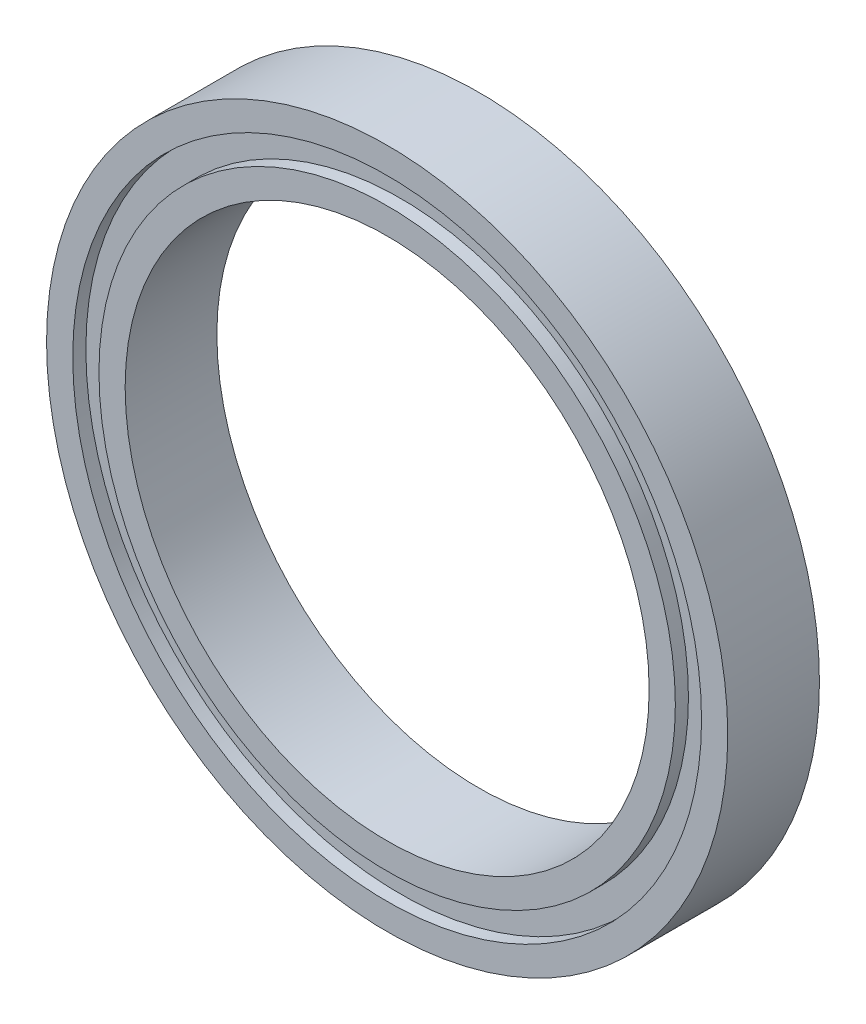
ISO-10303-21;
HEADER;
FILE_DESCRIPTION(('STEP AP214'),'2;1');
FILE_NAME('part.step','',(''),(''),'','','');
FILE_SCHEMA(('AUTOMOTIVE_DESIGN { 1 0 10303 214 1 1 1 1 }'));
ENDSEC;
DATA;
#1=APPLICATION_CONTEXT('core data for automotive mechanical design processes');
#2=APPLICATION_PROTOCOL_DEFINITION('international standard','automotive_design',2000,#1);
#3=PRODUCT_CONTEXT('',#1,'mechanical');
#4=PRODUCT('Part','Part','',(#3));
#5=PRODUCT_RELATED_PRODUCT_CATEGORY('part','',(#4));
#6=PRODUCT_DEFINITION_FORMATION('','',#4);
#7=PRODUCT_DEFINITION_CONTEXT('part definition',#1,'design');
#8=PRODUCT_DEFINITION('design','',#6,#7);
#9=PRODUCT_DEFINITION_SHAPE('','',#8);
#10=(LENGTH_UNIT() NAMED_UNIT(*) SI_UNIT(.MILLI.,.METRE.));
#11=(NAMED_UNIT(*) PLANE_ANGLE_UNIT() SI_UNIT($,.RADIAN.));
#12=(NAMED_UNIT(*) SI_UNIT($,.STERADIAN.) SOLID_ANGLE_UNIT());
#13=UNCERTAINTY_MEASURE_WITH_UNIT(LENGTH_MEASURE(1.E-05),#10,'distance_accuracy_value','');
#14=(GEOMETRIC_REPRESENTATION_CONTEXT(3) GLOBAL_UNCERTAINTY_ASSIGNED_CONTEXT((#13)) GLOBAL_UNIT_ASSIGNED_CONTEXT((#10,
#11,#12)) REPRESENTATION_CONTEXT('',''));
#15=CARTESIAN_POINT('',(0.,0.,0.));
#16=DIRECTION('',(0.,0.,1.));
#17=DIRECTION('',(1.,0.,0.));
#18=AXIS2_PLACEMENT_3D('',#15,#16,#17);
#19=CARTESIAN_POINT('',(0.,0.,-3.50000000000015));
#20=DIRECTION('',(0.,0.,1.));
#21=DIRECTION('',(0.999999999999999,0.,0.));
#22=AXIS2_PLACEMENT_3D('',#19,#20,#21);
#23=PLANE('',#22);
#24=CARTESIAN_POINT('',(0.,0.,-3.50000000000015));
#25=DIRECTION('',(0.,0.,1.));
#26=DIRECTION('',(0.999999999999999,0.,0.));
#27=AXIS2_PLACEMENT_3D('',#24,#25,#26);
#28=CIRCLE('',#27,26.);
#29=CARTESIAN_POINT('',(26.,-3.80834253022044E-13,-3.50000000000001));
#30=VERTEX_POINT('',#29);
#31=EDGE_CURVE('E45',#30,#30,#28,.T.);
#32=ORIENTED_EDGE('',*,*,#31,.F.);
#33=EDGE_LOOP('',(#32));
#34=FACE_BOUND('',#33,.T.);
#35=CARTESIAN_POINT('',(0.,0.,-3.50000000000015));
#36=DIRECTION('',(0.,0.,1.));
#37=DIRECTION('',(0.999999999999999,0.,0.));
#38=AXIS2_PLACEMENT_3D('',#35,#36,#37);
#39=CIRCLE('',#38,24.);
#40=CARTESIAN_POINT('',(24.,-3.56076279572903E-13,-3.50000000000002));
#41=VERTEX_POINT('',#40);
#42=EDGE_CURVE('E69',#41,#41,#39,.T.);
#43=ORIENTED_EDGE('',*,*,#42,.T.);
#44=EDGE_LOOP('',(#43));
#45=FACE_BOUND('',#44,.T.);
#46=ADVANCED_FACE('F34',(#34,#45),#23,.F.);
#47=CARTESIAN_POINT('',(0.,0.,3.49999999999989));
#48=DIRECTION('',(0.,0.,1.));
#49=DIRECTION('',(0.999999999999999,0.,0.));
#50=AXIS2_PLACEMENT_3D('',#47,#48,#49);
#51=PLANE('',#50);
#52=CARTESIAN_POINT('',(0.,0.,3.49999999999989));
#53=DIRECTION('',(0.,0.,1.));
#54=DIRECTION('',(0.999999999999999,0.,0.));
#55=AXIS2_PLACEMENT_3D('',#52,#53,#54);
#56=CIRCLE('',#55,20.);
#57=CARTESIAN_POINT('',(20.,-2.71865863155085E-13,3.5));
#58=VERTEX_POINT('',#57);
#59=EDGE_CURVE('E41',#58,#58,#56,.T.);
#60=ORIENTED_EDGE('',*,*,#59,.F.);
#61=EDGE_LOOP('',(#60));
#62=FACE_BOUND('',#61,.T.);
#63=CARTESIAN_POINT('',(0.,0.,3.49999999999989));
#64=DIRECTION('',(0.,0.,1.));
#65=DIRECTION('',(0.999999999999999,0.,0.));
#66=AXIS2_PLACEMENT_3D('',#63,#64,#65);
#67=CIRCLE('',#66,22.);
#68=CARTESIAN_POINT('',(22.,-2.96623836604226E-13,3.50000000000001));
#69=VERTEX_POINT('',#68);
#70=EDGE_CURVE('E63',#69,#69,#67,.T.);
#71=ORIENTED_EDGE('',*,*,#70,.T.);
#72=EDGE_LOOP('',(#71));
#73=FACE_BOUND('',#72,.T.);
#74=ADVANCED_FACE('F97',(#62,#73),#51,.T.);
#75=CARTESIAN_POINT('',(0.,0.,3.49999999999989));
#76=DIRECTION('',(0.,0.,1.));
#77=DIRECTION('',(0.999999999999999,0.,0.));
#78=AXIS2_PLACEMENT_3D('',#75,#76,#77);
#79=CIRCLE('',#78,24.);
#80=CARTESIAN_POINT('',(24.,-3.21381810053367E-13,3.50000000000002));
#81=VERTEX_POINT('',#80);
#82=EDGE_CURVE('E57',#81,#81,#79,.T.);
#83=ORIENTED_EDGE('',*,*,#82,.F.);
#84=EDGE_LOOP('',(#83));
#85=FACE_BOUND('',#84,.T.);
#86=CARTESIAN_POINT('',(0.,0.,3.49999999999989));
#87=DIRECTION('',(0.,0.,1.));
#88=DIRECTION('',(0.999999999999999,0.,0.));
#89=AXIS2_PLACEMENT_3D('',#86,#87,#88);
#90=CIRCLE('',#89,26.);
#91=CARTESIAN_POINT('',(26.,-3.46139783502508E-13,3.50000000000003));
#92=VERTEX_POINT('',#91);
#93=EDGE_CURVE('E10',#92,#92,#90,.T.);
#94=ORIENTED_EDGE('',*,*,#93,.T.);
#95=EDGE_LOOP('',(#94));
#96=FACE_BOUND('',#95,.T.);
#97=ADVANCED_FACE('F94',(#85,#96),#51,.T.);
#98=CARTESIAN_POINT('',(0.,0.,3.49999999999989));
#99=DIRECTION('',(0.,0.,-1.));
#100=DIRECTION('',(-0.999999999999999,0.,0.));
#101=AXIS2_PLACEMENT_3D('',#98,#99,#100);
#102=CYLINDRICAL_SURFACE('',#101,26.);
#103=ORIENTED_EDGE('',*,*,#93,.F.);
#104=EDGE_LOOP('',(#103));
#105=FACE_BOUND('',#104,.T.);
#106=ORIENTED_EDGE('',*,*,#31,.T.);
#107=EDGE_LOOP('',(#106));
#108=FACE_BOUND('',#107,.T.);
#109=ADVANCED_FACE('F36',(#105,#108),#102,.T.);
#110=CARTESIAN_POINT('',(0.,0.,3.49999999999989));
#111=DIRECTION('',(0.,0.,-1.));
#112=DIRECTION('',(-0.999999999999999,0.,0.));
#113=AXIS2_PLACEMENT_3D('',#110,#111,#112);
#114=CYLINDRICAL_SURFACE('',#113,20.);
#115=ORIENTED_EDGE('',*,*,#59,.T.);
#116=EDGE_LOOP('',(#115));
#117=FACE_BOUND('',#116,.T.);
#118=CARTESIAN_POINT('',(0.,0.,-3.50000000000015));
#119=DIRECTION('',(0.,0.,1.));
#120=DIRECTION('',(0.999999999999999,0.,0.));
#121=AXIS2_PLACEMENT_3D('',#118,#119,#120);
#122=CIRCLE('',#121,20.);
#123=CARTESIAN_POINT('',(20.,-3.06560332674621E-13,-3.50000000000004));
#124=VERTEX_POINT('',#123);
#125=EDGE_CURVE('E49',#124,#124,#122,.T.);
#126=ORIENTED_EDGE('',*,*,#125,.F.);
#127=EDGE_LOOP('',(#126));
#128=FACE_BOUND('',#127,.T.);
#129=ADVANCED_FACE('F85',(#117,#128),#114,.F.);
#130=CARTESIAN_POINT('',(0.,0.,-3.50000000000015));
#131=DIRECTION('',(0.,0.,1.));
#132=DIRECTION('',(0.999999999999999,0.,0.));
#133=AXIS2_PLACEMENT_3D('',#130,#131,#132);
#134=CIRCLE('',#133,22.);
#135=CARTESIAN_POINT('',(22.,-3.31318306123762E-13,-3.50000000000003));
#136=VERTEX_POINT('',#135);
#137=EDGE_CURVE('E75',#136,#136,#134,.T.);
#138=ORIENTED_EDGE('',*,*,#137,.F.);
#139=EDGE_LOOP('',(#138));
#140=FACE_BOUND('',#139,.T.);
#141=ORIENTED_EDGE('',*,*,#125,.T.);
#142=EDGE_LOOP('',(#141));
#143=FACE_BOUND('',#142,.T.);
#144=ADVANCED_FACE('F81',(#140,#143),#23,.F.);
#145=CARTESIAN_POINT('',(0.,0.,2.49999999999988));
#146=DIRECTION('',(0.,0.,1.));
#147=DIRECTION('',(0.999999999999999,0.,0.));
#148=AXIS2_PLACEMENT_3D('',#145,#146,#147);
#149=CYLINDRICAL_SURFACE('',#148,24.);
#150=CARTESIAN_POINT('',(0.,0.,2.49999999999988));
#151=DIRECTION('',(0.,0.,1.));
#152=DIRECTION('',(0.999999999999999,0.,0.));
#153=AXIS2_PLACEMENT_3D('',#150,#151,#152);
#154=CIRCLE('',#153,24.);
#155=CARTESIAN_POINT('',(24.,-3.10973469197506E-13,2.50000000000002));
#156=VERTEX_POINT('',#155);
#157=EDGE_CURVE('E54',#156,#156,#154,.T.);
#158=ORIENTED_EDGE('',*,*,#157,.F.);
#159=EDGE_LOOP('',(#158));
#160=FACE_BOUND('',#159,.T.);
#161=ORIENTED_EDGE('',*,*,#82,.T.);
#162=EDGE_LOOP('',(#161));
#163=FACE_BOUND('',#162,.T.);
#164=ADVANCED_FACE('F84',(#160,#163),#149,.F.);
#165=CARTESIAN_POINT('',(0.,0.,2.49999999999988));
#166=DIRECTION('',(0.,0.,1.));
#167=DIRECTION('',(0.999999999999999,0.,0.));
#168=AXIS2_PLACEMENT_3D('',#165,#166,#167);
#169=PLANE('',#168);
#170=CARTESIAN_POINT('',(0.,0.,2.49999999999988));
#171=DIRECTION('',(0.,0.,1.));
#172=DIRECTION('',(0.999999999999999,0.,0.));
#173=AXIS2_PLACEMENT_3D('',#170,#171,#172);
#174=CIRCLE('',#173,22.);
#175=CARTESIAN_POINT('',(22.,-2.86215495748365E-13,2.50000000000001));
#176=VERTEX_POINT('',#175);
#177=EDGE_CURVE('E60',#176,#176,#174,.T.);
#178=ORIENTED_EDGE('',*,*,#177,.F.);
#179=EDGE_LOOP('',(#178));
#180=FACE_BOUND('',#179,.T.);
#181=ORIENTED_EDGE('',*,*,#157,.T.);
#182=EDGE_LOOP('',(#181));
#183=FACE_BOUND('',#182,.T.);
#184=ADVANCED_FACE('F108',(#180,#183),#169,.T.);
#185=CARTESIAN_POINT('',(0.,0.,2.49999999999988));
#186=DIRECTION('',(0.,0.,1.));
#187=DIRECTION('',(0.999999999999999,0.,0.));
#188=AXIS2_PLACEMENT_3D('',#185,#186,#187);
#189=CYLINDRICAL_SURFACE('',#188,22.);
#190=ORIENTED_EDGE('',*,*,#177,.T.);
#191=EDGE_LOOP('',(#190));
#192=FACE_BOUND('',#191,.T.);
#193=ORIENTED_EDGE('',*,*,#70,.F.);
#194=EDGE_LOOP('',(#193));
#195=FACE_BOUND('',#194,.T.);
#196=ADVANCED_FACE('F112',(#192,#195),#189,.T.);
#197=CARTESIAN_POINT('',(0.,0.,-2.50000000000009));
#198=DIRECTION('',(0.,0.,-1.));
#199=DIRECTION('',(0.999999999999999,0.,0.));
#200=AXIS2_PLACEMENT_3D('',#197,#198,#199);
#201=PLANE('',#200);
#202=CARTESIAN_POINT('',(0.,0.,-2.50000000000009));
#203=DIRECTION('',(0.,0.,1.));
#204=DIRECTION('',(0.999999999999999,0.,0.));
#205=AXIS2_PLACEMENT_3D('',#202,#203,#204);
#206=CIRCLE('',#205,24.);
#207=CARTESIAN_POINT('',(23.9999999999999,-3.24851257005321E-13,-2.49999999999996));
#208=VERTEX_POINT('',#207);
#209=EDGE_CURVE('E66',#208,#208,#206,.T.);
#210=ORIENTED_EDGE('',*,*,#209,.F.);
#211=EDGE_LOOP('',(#210));
#212=FACE_BOUND('',#211,.T.);
#213=CARTESIAN_POINT('',(0.,0.,-2.50000000000009));
#214=DIRECTION('',(0.,0.,1.));
#215=DIRECTION('',(0.999999999999999,0.,0.));
#216=AXIS2_PLACEMENT_3D('',#213,#214,#215);
#217=CIRCLE('',#216,22.);
#218=CARTESIAN_POINT('',(21.9999999999999,-3.0009328355618E-13,-2.49999999999997));
#219=VERTEX_POINT('',#218);
#220=EDGE_CURVE('E72',#219,#219,#217,.T.);
#221=ORIENTED_EDGE('',*,*,#220,.T.);
#222=EDGE_LOOP('',(#221));
#223=FACE_BOUND('',#222,.T.);
#224=ADVANCED_FACE('F116',(#212,#223),#201,.T.);
#225=CARTESIAN_POINT('',(0.,0.,-2.50000000000009));
#226=DIRECTION('',(0.,0.,-1.));
#227=DIRECTION('',(-0.999999999999999,0.,0.));
#228=AXIS2_PLACEMENT_3D('',#225,#226,#227);
#229=CYLINDRICAL_SURFACE('',#228,24.);
#230=ORIENTED_EDGE('',*,*,#209,.T.);
#231=EDGE_LOOP('',(#230));
#232=FACE_BOUND('',#231,.T.);
#233=ORIENTED_EDGE('',*,*,#42,.F.);
#234=EDGE_LOOP('',(#233));
#235=FACE_BOUND('',#234,.T.);
#236=ADVANCED_FACE('F118',(#232,#235),#229,.F.);
#237=CARTESIAN_POINT('',(0.,0.,-2.50000000000009));
#238=DIRECTION('',(0.,0.,-1.));
#239=DIRECTION('',(-0.999999999999999,0.,0.));
#240=AXIS2_PLACEMENT_3D('',#237,#238,#239);
#241=CYLINDRICAL_SURFACE('',#240,22.);
#242=ORIENTED_EDGE('',*,*,#220,.F.);
#243=EDGE_LOOP('',(#242));
#244=FACE_BOUND('',#243,.T.);
#245=ORIENTED_EDGE('',*,*,#137,.T.);
#246=EDGE_LOOP('',(#245));
#247=FACE_BOUND('',#246,.T.);
#248=ADVANCED_FACE('F79',(#244,#247),#241,.T.);
#249=CLOSED_SHELL('',(#46,#74,#97,#109,#129,#144,#164,#184,#196,#224,#236,#248));
#250=MANIFOLD_SOLID_BREP('B2',#249);
#251=ADVANCED_BREP_SHAPE_REPRESENTATION('',(#18,#250),#14);
#252=SHAPE_DEFINITION_REPRESENTATION(#9,#251);
ENDSEC;
END-ISO-10303-21;
